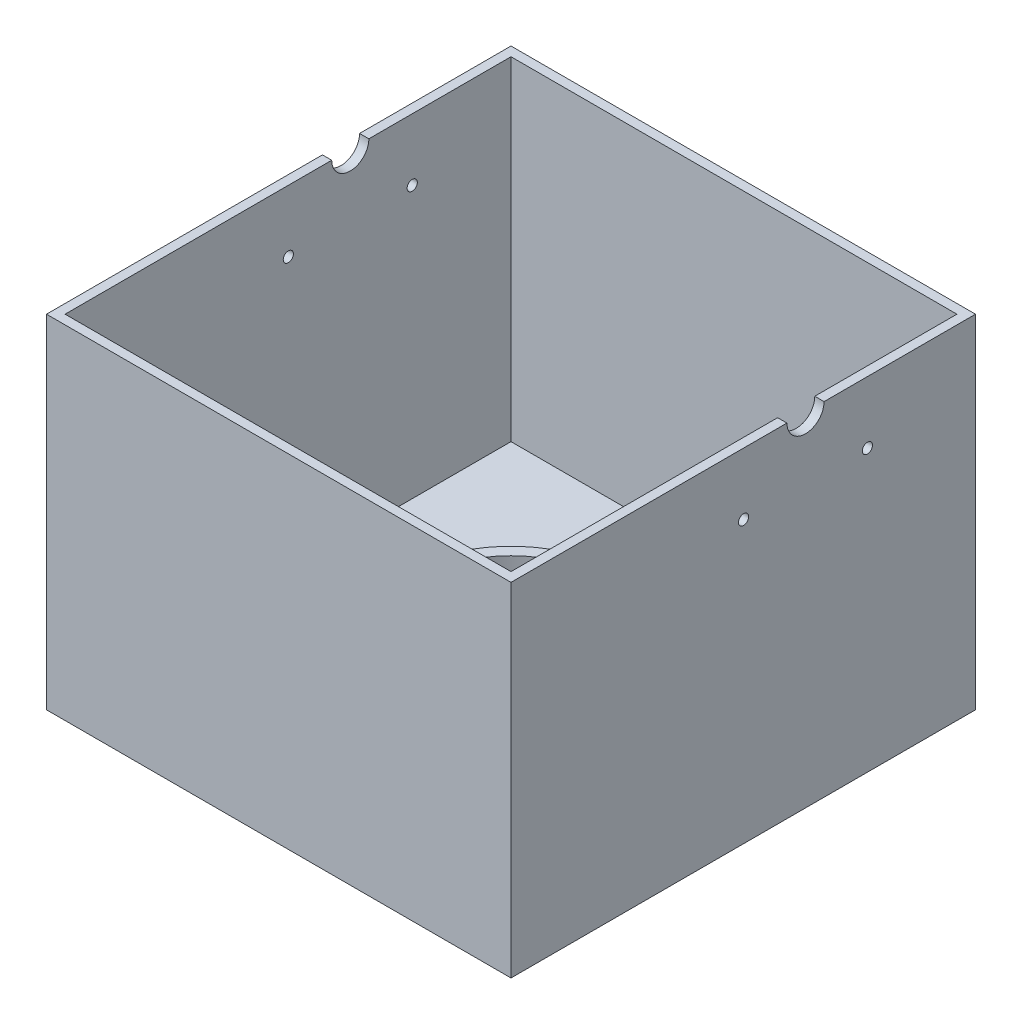
ISO-10303-21;
HEADER;
FILE_DESCRIPTION(('STEP AP214'),'2;1');
FILE_NAME('part.step','',(''),(''),'','','');
FILE_SCHEMA(('AUTOMOTIVE_DESIGN { 1 0 10303 214 1 1 1 1 }'));
ENDSEC;
DATA;
#1=APPLICATION_CONTEXT('core data for automotive mechanical design processes');
#2=APPLICATION_PROTOCOL_DEFINITION('international standard','automotive_design',2000,#1);
#3=PRODUCT_CONTEXT('',#1,'mechanical');
#4=PRODUCT('Part','Part','',(#3));
#5=PRODUCT_RELATED_PRODUCT_CATEGORY('part','',(#4));
#6=PRODUCT_DEFINITION_FORMATION('','',#4);
#7=PRODUCT_DEFINITION_CONTEXT('part definition',#1,'design');
#8=PRODUCT_DEFINITION('design','',#6,#7);
#9=PRODUCT_DEFINITION_SHAPE('','',#8);
#10=(LENGTH_UNIT() NAMED_UNIT(*) SI_UNIT(.MILLI.,.METRE.));
#11=(NAMED_UNIT(*) PLANE_ANGLE_UNIT() SI_UNIT($,.RADIAN.));
#12=(NAMED_UNIT(*) SI_UNIT($,.STERADIAN.) SOLID_ANGLE_UNIT());
#13=UNCERTAINTY_MEASURE_WITH_UNIT(LENGTH_MEASURE(1.E-05),#10,'distance_accuracy_value','');
#14=(GEOMETRIC_REPRESENTATION_CONTEXT(3) GLOBAL_UNCERTAINTY_ASSIGNED_CONTEXT((#13)) GLOBAL_UNIT_ASSIGNED_CONTEXT((#10,
#11,#12)) REPRESENTATION_CONTEXT('',''));
#15=CARTESIAN_POINT('',(0.,0.,0.));
#16=DIRECTION('',(0.,0.,1.));
#17=DIRECTION('',(1.,0.,0.));
#18=AXIS2_PLACEMENT_3D('',#15,#16,#17);
#19=CARTESIAN_POINT('',(0.,91.,0.));
#20=DIRECTION('',(0.,-1.,0.));
#21=DIRECTION('',(0.,0.,-1.));
#22=AXIS2_PLACEMENT_3D('',#19,#20,#21);
#23=CYLINDRICAL_SURFACE('',#22,31.25);
#24=CARTESIAN_POINT('',(0.,21.,0.));
#25=DIRECTION('',(0.,1.,0.));
#26=DIRECTION('',(0.,0.,1.));
#27=AXIS2_PLACEMENT_3D('',#24,#25,#26);
#28=CIRCLE('',#27,31.25);
#29=CARTESIAN_POINT('',(0.,21.,31.25));
#30=VERTEX_POINT('',#29);
#31=EDGE_CURVE('E211',#30,#30,#28,.T.);
#32=ORIENTED_EDGE('',*,*,#31,.T.);
#33=EDGE_LOOP('',(#32));
#34=FACE_BOUND('',#33,.T.);
#35=CARTESIAN_POINT('',(0.,-12.,0.));
#36=DIRECTION('',(0.,-1.,0.));
#37=DIRECTION('',(0.,0.,-1.));
#38=AXIS2_PLACEMENT_3D('',#35,#36,#37);
#39=CIRCLE('',#38,31.25);
#40=CARTESIAN_POINT('',(0.,-12.,-31.25));
#41=VERTEX_POINT('',#40);
#42=EDGE_CURVE('E11',#41,#41,#39,.F.);
#43=ORIENTED_EDGE('',*,*,#42,.F.);
#44=EDGE_LOOP('',(#43));
#45=FACE_BOUND('',#44,.T.);
#46=ADVANCED_FACE('F39',(#34,#45),#23,.F.);
#47=CARTESIAN_POINT('',(0.,0.,0.));
#48=DIRECTION('',(0.,1.,0.));
#49=DIRECTION('',(0.,0.,1.));
#50=AXIS2_PLACEMENT_3D('',#47,#48,#49);
#51=PLANE('',#50);
#52=DIRECTION('',(0.,0.,-1.));
#53=VECTOR('',#52,1.);
#54=CARTESIAN_POINT('',(75.,0.,-75.));
#55=LINE('',#54,#53);
#56=CARTESIAN_POINT('',(75.,0.,75.));
#57=VERTEX_POINT('',#56);
#58=CARTESIAN_POINT('',(75.,0.,-75.));
#59=VERTEX_POINT('',#58);
#60=EDGE_CURVE('E158',#57,#59,#55,.T.);
#61=ORIENTED_EDGE('',*,*,#60,.F.);
#62=DIRECTION('',(1.,0.,0.));
#63=VECTOR('',#62,1.);
#64=CARTESIAN_POINT('',(-75.,0.,75.));
#65=LINE('',#64,#63);
#66=CARTESIAN_POINT('',(-75.,0.,75.));
#67=VERTEX_POINT('',#66);
#68=EDGE_CURVE('E172',#67,#57,#65,.T.);
#69=ORIENTED_EDGE('',*,*,#68,.F.);
#70=DIRECTION('',(0.,0.,1.));
#71=VECTOR('',#70,1.);
#72=CARTESIAN_POINT('',(-75.,0.,-75.));
#73=LINE('',#72,#71);
#74=CARTESIAN_POINT('',(-75.,0.,-75.));
#75=VERTEX_POINT('',#74);
#76=EDGE_CURVE('E169',#75,#67,#73,.T.);
#77=ORIENTED_EDGE('',*,*,#76,.F.);
#78=DIRECTION('',(-1.,0.,0.));
#79=VECTOR('',#78,1.);
#80=CARTESIAN_POINT('',(-75.,0.,-75.));
#81=LINE('',#80,#79);
#82=EDGE_CURVE('E166',#59,#75,#81,.T.);
#83=ORIENTED_EDGE('',*,*,#82,.F.);
#84=EDGE_LOOP('',(#61,#69,#77,#83));
#85=FACE_BOUND('',#84,.T.);
#86=CARTESIAN_POINT('',(0.,0.,0.));
#87=DIRECTION('',(0.,1.,0.));
#88=DIRECTION('',(0.,0.,1.));
#89=AXIS2_PLACEMENT_3D('',#86,#87,#88);
#90=CIRCLE('',#89,35.);
#91=CARTESIAN_POINT('',(0.,0.,35.));
#92=VERTEX_POINT('',#91);
#93=EDGE_CURVE('E48',#92,#92,#90,.F.);
#94=ORIENTED_EDGE('',*,*,#93,.F.);
#95=EDGE_LOOP('',(#94));
#96=FACE_BOUND('',#95,.T.);
#97=ADVANCED_FACE('F305',(#85,#96),#51,.F.);
#98=CARTESIAN_POINT('',(0.,3.,0.));
#99=DIRECTION('',(0.,1.,0.));
#100=DIRECTION('',(0.,0.,1.));
#101=AXIS2_PLACEMENT_3D('',#98,#99,#100);
#102=PLANE('',#101);
#103=DIRECTION('',(0.,0.,1.));
#104=VECTOR('',#103,1.);
#105=CARTESIAN_POINT('',(-72.,3.,72.));
#106=LINE('',#105,#104);
#107=CARTESIAN_POINT('',(-72.,3.,-72.));
#108=VERTEX_POINT('',#107);
#109=CARTESIAN_POINT('',(-72.,3.,72.));
#110=VERTEX_POINT('',#109);
#111=EDGE_CURVE('E258',#108,#110,#106,.T.);
#112=ORIENTED_EDGE('',*,*,#111,.T.);
#113=DIRECTION('',(1.,0.,0.));
#114=VECTOR('',#113,1.);
#115=CARTESIAN_POINT('',(72.,3.,72.));
#116=LINE('',#115,#114);
#117=CARTESIAN_POINT('',(72.,3.,72.));
#118=VERTEX_POINT('',#117);
#119=EDGE_CURVE('E261',#110,#118,#116,.T.);
#120=ORIENTED_EDGE('',*,*,#119,.T.);
#121=DIRECTION('',(0.,0.,-1.));
#122=VECTOR('',#121,1.);
#123=CARTESIAN_POINT('',(72.,3.,72.));
#124=LINE('',#123,#122);
#125=CARTESIAN_POINT('',(72.,3.,-72.));
#126=VERTEX_POINT('',#125);
#127=EDGE_CURVE('E264',#118,#126,#124,.T.);
#128=ORIENTED_EDGE('',*,*,#127,.T.);
#129=DIRECTION('',(-1.,0.,0.));
#130=VECTOR('',#129,1.);
#131=CARTESIAN_POINT('',(72.,3.,-72.));
#132=LINE('',#131,#130);
#133=EDGE_CURVE('E267',#126,#108,#132,.T.);
#134=ORIENTED_EDGE('',*,*,#133,.T.);
#135=EDGE_LOOP('',(#112,#120,#128,#134));
#136=FACE_BOUND('',#135,.T.);
#137=CARTESIAN_POINT('',(0.,3.,0.));
#138=DIRECTION('',(0.,1.,0.));
#139=DIRECTION('',(0.,0.,1.));
#140=AXIS2_PLACEMENT_3D('',#137,#138,#139);
#141=CIRCLE('',#140,35.);
#142=CARTESIAN_POINT('',(0.,3.,35.));
#143=VERTEX_POINT('',#142);
#144=EDGE_CURVE('E192',#143,#143,#141,.F.);
#145=ORIENTED_EDGE('',*,*,#144,.T.);
#146=EDGE_LOOP('',(#145));
#147=FACE_BOUND('',#146,.T.);
#148=ADVANCED_FACE('F333',(#136,#147),#102,.T.);
#149=CARTESIAN_POINT('',(0.,110.65,0.));
#150=DIRECTION('',(0.,1.,0.));
#151=DIRECTION('',(0.,0.,1.));
#152=AXIS2_PLACEMENT_3D('',#149,#150,#151);
#153=PLANE('',#152);
#154=DIRECTION('',(-1.,0.,0.));
#155=VECTOR('',#154,1.);
#156=CARTESIAN_POINT('',(75.,110.65,-26.1));
#157=LINE('',#156,#155);
#158=CARTESIAN_POINT('',(75.,110.65,-26.1));
#159=VERTEX_POINT('',#158);
#160=CARTESIAN_POINT('',(72.,110.65,-26.1));
#161=VERTEX_POINT('',#160);
#162=EDGE_CURVE('E63',#159,#161,#157,.T.);
#163=ORIENTED_EDGE('',*,*,#162,.F.);
#164=DIRECTION('',(0.,0.,-1.));
#165=VECTOR('',#164,1.);
#166=CARTESIAN_POINT('',(75.,110.65,75.));
#167=LINE('',#166,#165);
#168=CARTESIAN_POINT('',(75.,110.65,-75.));
#169=VERTEX_POINT('',#168);
#170=EDGE_CURVE('E144',#159,#169,#167,.T.);
#171=ORIENTED_EDGE('',*,*,#170,.T.);
#172=DIRECTION('',(-1.,0.,0.));
#173=VECTOR('',#172,1.);
#174=CARTESIAN_POINT('',(75.,110.65,-75.));
#175=LINE('',#174,#173);
#176=CARTESIAN_POINT('',(-75.,110.65,-75.));
#177=VERTEX_POINT('',#176);
#178=EDGE_CURVE('E153',#169,#177,#175,.T.);
#179=ORIENTED_EDGE('',*,*,#178,.T.);
#180=DIRECTION('',(0.,0.,1.));
#181=VECTOR('',#180,1.);
#182=CARTESIAN_POINT('',(-75.,110.65,75.));
#183=LINE('',#182,#181);
#184=CARTESIAN_POINT('',(-75.,110.65,-26.1));
#185=VERTEX_POINT('',#184);
#186=EDGE_CURVE('E285',#177,#185,#183,.T.);
#187=ORIENTED_EDGE('',*,*,#186,.T.);
#188=CARTESIAN_POINT('',(-72.,110.65,-26.1));
#189=VERTEX_POINT('',#188);
#190=EDGE_CURVE('E239',#189,#185,#157,.T.);
#191=ORIENTED_EDGE('',*,*,#190,.F.);
#192=DIRECTION('',(0.,0.,1.));
#193=VECTOR('',#192,1.);
#194=CARTESIAN_POINT('',(-72.,110.65,72.));
#195=LINE('',#194,#193);
#196=CARTESIAN_POINT('',(-72.,110.65,-72.));
#197=VERTEX_POINT('',#196);
#198=EDGE_CURVE('E242',#197,#189,#195,.T.);
#199=ORIENTED_EDGE('',*,*,#198,.F.);
#200=DIRECTION('',(-1.,0.,0.));
#201=VECTOR('',#200,1.);
#202=CARTESIAN_POINT('',(72.,110.65,-72.));
#203=LINE('',#202,#201);
#204=CARTESIAN_POINT('',(72.,110.65,-72.));
#205=VERTEX_POINT('',#204);
#206=EDGE_CURVE('E254',#205,#197,#203,.T.);
#207=ORIENTED_EDGE('',*,*,#206,.F.);
#208=DIRECTION('',(0.,0.,-1.));
#209=VECTOR('',#208,1.);
#210=CARTESIAN_POINT('',(72.,110.65,72.));
#211=LINE('',#210,#209);
#212=EDGE_CURVE('E250',#161,#205,#211,.T.);
#213=ORIENTED_EDGE('',*,*,#212,.F.);
#214=EDGE_LOOP('',(#163,#171,#179,#187,#191,#199,#207,#213));
#215=FACE_BOUND('',#214,.T.);
#216=ADVANCED_FACE('F310',(#215),#153,.T.);
#217=CARTESIAN_POINT('',(75.,3.,-75.));
#218=DIRECTION('',(-1.,0.,0.));
#219=DIRECTION('',(0.,0.,1.));
#220=AXIS2_PLACEMENT_3D('',#217,#218,#219);
#221=PLANE('',#220);
#222=CARTESIAN_POINT('',(75.,90.65,-40.1));
#223=DIRECTION('',(-1.,0.,0.));
#224=DIRECTION('',(0.,0.,1.));
#225=AXIS2_PLACEMENT_3D('',#222,#223,#224);
#226=CIRCLE('',#225,1.65);
#227=CARTESIAN_POINT('',(75.,90.65,-38.45));
#228=VERTEX_POINT('',#227);
#229=EDGE_CURVE('E201',#228,#228,#226,.T.);
#230=ORIENTED_EDGE('',*,*,#229,.T.);
#231=EDGE_LOOP('',(#230));
#232=FACE_BOUND('',#231,.T.);
#233=CARTESIAN_POINT('',(75.,90.65,-0.10000000000001));
#234=DIRECTION('',(-1.,0.,0.));
#235=DIRECTION('',(0.,0.,1.));
#236=AXIS2_PLACEMENT_3D('',#233,#234,#235);
#237=CIRCLE('',#236,1.65);
#238=CARTESIAN_POINT('',(75.,90.65,1.54999999999999));
#239=VERTEX_POINT('',#238);
#240=EDGE_CURVE('E411',#239,#239,#237,.T.);
#241=ORIENTED_EDGE('',*,*,#240,.T.);
#242=EDGE_LOOP('',(#241));
#243=FACE_BOUND('',#242,.T.);
#244=ORIENTED_EDGE('',*,*,#170,.F.);
#245=CARTESIAN_POINT('',(75.,110.65,-20.1));
#246=DIRECTION('',(-1.,0.,0.));
#247=DIRECTION('',(0.,0.,1.));
#248=AXIS2_PLACEMENT_3D('',#245,#246,#247);
#249=CIRCLE('',#248,6.);
#250=CARTESIAN_POINT('',(75.,110.65,-14.1));
#251=VERTEX_POINT('',#250);
#252=EDGE_CURVE('E130',#159,#251,#249,.T.);
#253=ORIENTED_EDGE('',*,*,#252,.T.);
#254=CARTESIAN_POINT('',(75.,110.65,75.));
#255=VERTEX_POINT('',#254);
#256=EDGE_CURVE('E142',#255,#251,#167,.T.);
#257=ORIENTED_EDGE('',*,*,#256,.F.);
#258=DIRECTION('',(0.,-1.,0.));
#259=VECTOR('',#258,1.);
#260=CARTESIAN_POINT('',(75.,3.,75.));
#261=LINE('',#260,#259);
#262=EDGE_CURVE('E175',#255,#57,#261,.T.);
#263=ORIENTED_EDGE('',*,*,#262,.T.);
#264=ORIENTED_EDGE('',*,*,#60,.T.);
#265=DIRECTION('',(0.,-1.,0.));
#266=VECTOR('',#265,1.);
#267=CARTESIAN_POINT('',(75.,3.,-75.));
#268=LINE('',#267,#266);
#269=EDGE_CURVE('E186',#169,#59,#268,.T.);
#270=ORIENTED_EDGE('',*,*,#269,.F.);
#271=EDGE_LOOP('',(#244,#253,#257,#263,#264,#270));
#272=FACE_BOUND('',#271,.T.);
#273=ADVANCED_FACE('F41',(#232,#243,#272),#221,.F.);
#274=CARTESIAN_POINT('',(-75.,3.,-75.));
#275=DIRECTION('',(0.,0.,1.));
#276=DIRECTION('',(1.,0.,0.));
#277=AXIS2_PLACEMENT_3D('',#274,#275,#276);
#278=PLANE('',#277);
#279=ORIENTED_EDGE('',*,*,#82,.T.);
#280=DIRECTION('',(0.,-1.,0.));
#281=VECTOR('',#280,1.);
#282=CARTESIAN_POINT('',(-75.,3.,-75.));
#283=LINE('',#282,#281);
#284=EDGE_CURVE('E182',#177,#75,#283,.T.);
#285=ORIENTED_EDGE('',*,*,#284,.F.);
#286=ORIENTED_EDGE('',*,*,#178,.F.);
#287=ORIENTED_EDGE('',*,*,#269,.T.);
#288=EDGE_LOOP('',(#279,#285,#286,#287));
#289=FACE_BOUND('',#288,.T.);
#290=ADVANCED_FACE('F309',(#289),#278,.F.);
#291=CARTESIAN_POINT('',(-75.,3.,-75.));
#292=DIRECTION('',(1.,0.,0.));
#293=DIRECTION('',(0.,0.,-1.));
#294=AXIS2_PLACEMENT_3D('',#291,#292,#293);
#295=PLANE('',#294);
#296=CARTESIAN_POINT('',(-75.,90.65,-40.1));
#297=DIRECTION('',(-1.,0.,0.));
#298=DIRECTION('',(0.,0.,1.));
#299=AXIS2_PLACEMENT_3D('',#296,#297,#298);
#300=CIRCLE('',#299,1.65);
#301=CARTESIAN_POINT('',(-75.,90.65,-38.45));
#302=VERTEX_POINT('',#301);
#303=EDGE_CURVE('E408',#302,#302,#300,.T.);
#304=ORIENTED_EDGE('',*,*,#303,.F.);
#305=EDGE_LOOP('',(#304));
#306=FACE_BOUND('',#305,.T.);
#307=CARTESIAN_POINT('',(-75.,90.65,-0.099999999999982));
#308=DIRECTION('',(-1.,0.,0.));
#309=DIRECTION('',(0.,0.,1.));
#310=AXIS2_PLACEMENT_3D('',#307,#308,#309);
#311=CIRCLE('',#310,1.65);
#312=CARTESIAN_POINT('',(-75.,90.65,1.55000000000002));
#313=VERTEX_POINT('',#312);
#314=EDGE_CURVE('E218',#313,#313,#311,.T.);
#315=ORIENTED_EDGE('',*,*,#314,.F.);
#316=EDGE_LOOP('',(#315));
#317=FACE_BOUND('',#316,.T.);
#318=CARTESIAN_POINT('',(-75.,110.65,-14.1));
#319=VERTEX_POINT('',#318);
#320=CARTESIAN_POINT('',(-75.,110.65,75.));
#321=VERTEX_POINT('',#320);
#322=EDGE_CURVE('E284',#319,#321,#183,.T.);
#323=ORIENTED_EDGE('',*,*,#322,.F.);
#324=CARTESIAN_POINT('',(-75.,110.65,-20.1));
#325=DIRECTION('',(-1.,0.,0.));
#326=DIRECTION('',(0.,0.,1.));
#327=AXIS2_PLACEMENT_3D('',#324,#325,#326);
#328=CIRCLE('',#327,6.);
#329=EDGE_CURVE('E146',#185,#319,#328,.T.);
#330=ORIENTED_EDGE('',*,*,#329,.F.);
#331=ORIENTED_EDGE('',*,*,#186,.F.);
#332=ORIENTED_EDGE('',*,*,#284,.T.);
#333=ORIENTED_EDGE('',*,*,#76,.T.);
#334=DIRECTION('',(0.,-1.,0.));
#335=VECTOR('',#334,1.);
#336=CARTESIAN_POINT('',(-75.,3.,75.));
#337=LINE('',#336,#335);
#338=EDGE_CURVE('E178',#321,#67,#337,.T.);
#339=ORIENTED_EDGE('',*,*,#338,.F.);
#340=EDGE_LOOP('',(#323,#330,#331,#332,#333,#339));
#341=FACE_BOUND('',#340,.T.);
#342=ADVANCED_FACE('F298',(#306,#317,#341),#295,.F.);
#343=CARTESIAN_POINT('',(-75.,3.,75.));
#344=DIRECTION('',(0.,0.,-1.));
#345=DIRECTION('',(-1.,0.,0.));
#346=AXIS2_PLACEMENT_3D('',#343,#344,#345);
#347=PLANE('',#346);
#348=ORIENTED_EDGE('',*,*,#68,.T.);
#349=ORIENTED_EDGE('',*,*,#262,.F.);
#350=DIRECTION('',(1.,0.,0.));
#351=VECTOR('',#350,1.);
#352=CARTESIAN_POINT('',(75.,110.65,75.));
#353=LINE('',#352,#351);
#354=EDGE_CURVE('E151',#321,#255,#353,.T.);
#355=ORIENTED_EDGE('',*,*,#354,.F.);
#356=ORIENTED_EDGE('',*,*,#338,.T.);
#357=EDGE_LOOP('',(#348,#349,#355,#356));
#358=FACE_BOUND('',#357,.T.);
#359=ADVANCED_FACE('F302',(#358),#347,.F.);
#360=DIRECTION('',(-1.,0.,0.));
#361=VECTOR('',#360,1.);
#362=CARTESIAN_POINT('',(75.,110.65,-14.1));
#363=LINE('',#362,#361);
#364=CARTESIAN_POINT('',(-72.,110.65,-14.1));
#365=VERTEX_POINT('',#364);
#366=EDGE_CURVE('E55',#319,#365,#363,.F.);
#367=ORIENTED_EDGE('',*,*,#366,.F.);
#368=ORIENTED_EDGE('',*,*,#322,.T.);
#369=ORIENTED_EDGE('',*,*,#354,.T.);
#370=ORIENTED_EDGE('',*,*,#256,.T.);
#371=CARTESIAN_POINT('',(72.,110.65,-14.1));
#372=VERTEX_POINT('',#371);
#373=EDGE_CURVE('E127',#372,#251,#363,.F.);
#374=ORIENTED_EDGE('',*,*,#373,.F.);
#375=CARTESIAN_POINT('',(72.,110.65,72.));
#376=VERTEX_POINT('',#375);
#377=EDGE_CURVE('E251',#376,#372,#211,.T.);
#378=ORIENTED_EDGE('',*,*,#377,.F.);
#379=DIRECTION('',(1.,0.,0.));
#380=VECTOR('',#379,1.);
#381=CARTESIAN_POINT('',(72.,110.65,72.));
#382=LINE('',#381,#380);
#383=CARTESIAN_POINT('',(-72.,110.65,72.));
#384=VERTEX_POINT('',#383);
#385=EDGE_CURVE('E246',#384,#376,#382,.T.);
#386=ORIENTED_EDGE('',*,*,#385,.F.);
#387=EDGE_CURVE('E247',#365,#384,#195,.T.);
#388=ORIENTED_EDGE('',*,*,#387,.F.);
#389=EDGE_LOOP('',(#367,#368,#369,#370,#374,#378,#386,#388));
#390=FACE_BOUND('',#389,.T.);
#391=ADVANCED_FACE('F149',(#390),#153,.T.);
#392=CARTESIAN_POINT('',(-72.,110.65,72.));
#393=DIRECTION('',(1.,0.,0.));
#394=DIRECTION('',(0.,0.,-1.));
#395=AXIS2_PLACEMENT_3D('',#392,#393,#394);
#396=PLANE('',#395);
#397=CARTESIAN_POINT('',(-72.,90.65,-40.1));
#398=DIRECTION('',(1.,0.,0.));
#399=DIRECTION('',(0.,0.,-1.));
#400=AXIS2_PLACEMENT_3D('',#397,#398,#399);
#401=CIRCLE('',#400,1.65);
#402=CARTESIAN_POINT('',(-72.,90.65,-41.75));
#403=VERTEX_POINT('',#402);
#404=EDGE_CURVE('E205',#403,#403,#401,.T.);
#405=ORIENTED_EDGE('',*,*,#404,.F.);
#406=EDGE_LOOP('',(#405));
#407=FACE_BOUND('',#406,.T.);
#408=CARTESIAN_POINT('',(-72.,90.65,-0.0999999999999826));
#409=DIRECTION('',(1.,0.,0.));
#410=DIRECTION('',(0.,0.,-1.));
#411=AXIS2_PLACEMENT_3D('',#408,#409,#410);
#412=CIRCLE('',#411,1.65);
#413=CARTESIAN_POINT('',(-72.,90.65,-1.74999999999998));
#414=VERTEX_POINT('',#413);
#415=EDGE_CURVE('E200',#414,#414,#412,.T.);
#416=ORIENTED_EDGE('',*,*,#415,.F.);
#417=EDGE_LOOP('',(#416));
#418=FACE_BOUND('',#417,.T.);
#419=CARTESIAN_POINT('',(-72.,110.65,-20.1));
#420=DIRECTION('',(1.,0.,0.));
#421=DIRECTION('',(0.,0.,-1.));
#422=AXIS2_PLACEMENT_3D('',#419,#420,#421);
#423=CIRCLE('',#422,6.);
#424=EDGE_CURVE('E238',#365,#189,#423,.T.);
#425=ORIENTED_EDGE('',*,*,#424,.F.);
#426=ORIENTED_EDGE('',*,*,#387,.T.);
#427=DIRECTION('',(0.,-1.,0.));
#428=VECTOR('',#427,1.);
#429=CARTESIAN_POINT('',(-72.,110.65,72.));
#430=LINE('',#429,#428);
#431=EDGE_CURVE('E281',#384,#110,#430,.T.);
#432=ORIENTED_EDGE('',*,*,#431,.T.);
#433=ORIENTED_EDGE('',*,*,#111,.F.);
#434=DIRECTION('',(0.,-1.,0.));
#435=VECTOR('',#434,1.);
#436=CARTESIAN_POINT('',(-72.,110.65,-72.));
#437=LINE('',#436,#435);
#438=EDGE_CURVE('E257',#197,#108,#437,.T.);
#439=ORIENTED_EDGE('',*,*,#438,.F.);
#440=ORIENTED_EDGE('',*,*,#198,.T.);
#441=EDGE_LOOP('',(#425,#426,#432,#433,#439,#440));
#442=FACE_BOUND('',#441,.T.);
#443=ADVANCED_FACE('F328',(#407,#418,#442),#396,.T.);
#444=CARTESIAN_POINT('',(72.,110.65,72.));
#445=DIRECTION('',(0.,0.,-1.));
#446=DIRECTION('',(-1.,0.,0.));
#447=AXIS2_PLACEMENT_3D('',#444,#445,#446);
#448=PLANE('',#447);
#449=ORIENTED_EDGE('',*,*,#119,.F.);
#450=ORIENTED_EDGE('',*,*,#431,.F.);
#451=ORIENTED_EDGE('',*,*,#385,.T.);
#452=DIRECTION('',(0.,-1.,0.));
#453=VECTOR('',#452,1.);
#454=CARTESIAN_POINT('',(72.,110.65,72.));
#455=LINE('',#454,#453);
#456=EDGE_CURVE('E277',#376,#118,#455,.T.);
#457=ORIENTED_EDGE('',*,*,#456,.T.);
#458=EDGE_LOOP('',(#449,#450,#451,#457));
#459=FACE_BOUND('',#458,.T.);
#460=ADVANCED_FACE('F336',(#459),#448,.T.);
#461=CARTESIAN_POINT('',(72.,110.65,72.));
#462=DIRECTION('',(-1.,0.,0.));
#463=DIRECTION('',(0.,0.,1.));
#464=AXIS2_PLACEMENT_3D('',#461,#462,#463);
#465=PLANE('',#464);
#466=CARTESIAN_POINT('',(72.,90.65,-40.1));
#467=DIRECTION('',(-1.,0.,0.));
#468=DIRECTION('',(0.,0.,1.));
#469=AXIS2_PLACEMENT_3D('',#466,#467,#468);
#470=CIRCLE('',#469,1.65);
#471=CARTESIAN_POINT('',(72.,90.65,-38.45));
#472=VERTEX_POINT('',#471);
#473=EDGE_CURVE('E202',#472,#472,#470,.T.);
#474=ORIENTED_EDGE('',*,*,#473,.F.);
#475=EDGE_LOOP('',(#474));
#476=FACE_BOUND('',#475,.T.);
#477=CARTESIAN_POINT('',(72.,90.65,-0.100000000000009));
#478=DIRECTION('',(-1.,0.,0.));
#479=DIRECTION('',(0.,0.,1.));
#480=AXIS2_PLACEMENT_3D('',#477,#478,#479);
#481=CIRCLE('',#480,1.65);
#482=CARTESIAN_POINT('',(72.,90.65,1.54999999999999));
#483=VERTEX_POINT('',#482);
#484=EDGE_CURVE('E197',#483,#483,#481,.T.);
#485=ORIENTED_EDGE('',*,*,#484,.F.);
#486=EDGE_LOOP('',(#485));
#487=FACE_BOUND('',#486,.T.);
#488=CARTESIAN_POINT('',(72.,110.65,-20.1));
#489=DIRECTION('',(-1.,0.,0.));
#490=DIRECTION('',(0.,0.,1.));
#491=AXIS2_PLACEMENT_3D('',#488,#489,#490);
#492=CIRCLE('',#491,6.);
#493=EDGE_CURVE('E131',#161,#372,#492,.T.);
#494=ORIENTED_EDGE('',*,*,#493,.F.);
#495=ORIENTED_EDGE('',*,*,#212,.T.);
#496=DIRECTION('',(0.,-1.,0.));
#497=VECTOR('',#496,1.);
#498=CARTESIAN_POINT('',(72.,110.65,-72.));
#499=LINE('',#498,#497);
#500=EDGE_CURVE('E273',#205,#126,#499,.T.);
#501=ORIENTED_EDGE('',*,*,#500,.T.);
#502=ORIENTED_EDGE('',*,*,#127,.F.);
#503=ORIENTED_EDGE('',*,*,#456,.F.);
#504=ORIENTED_EDGE('',*,*,#377,.T.);
#505=EDGE_LOOP('',(#494,#495,#501,#502,#503,#504));
#506=FACE_BOUND('',#505,.T.);
#507=ADVANCED_FACE('F320',(#476,#487,#506),#465,.T.);
#508=CARTESIAN_POINT('',(72.,110.65,-72.));
#509=DIRECTION('',(0.,0.,1.));
#510=DIRECTION('',(1.,0.,0.));
#511=AXIS2_PLACEMENT_3D('',#508,#509,#510);
#512=PLANE('',#511);
#513=ORIENTED_EDGE('',*,*,#133,.F.);
#514=ORIENTED_EDGE('',*,*,#500,.F.);
#515=ORIENTED_EDGE('',*,*,#206,.T.);
#516=ORIENTED_EDGE('',*,*,#438,.T.);
#517=EDGE_LOOP('',(#513,#514,#515,#516));
#518=FACE_BOUND('',#517,.T.);
#519=ADVANCED_FACE('F325',(#518),#512,.T.);
#520=CARTESIAN_POINT('',(75.,110.65,-20.1));
#521=DIRECTION('',(-1.,0.,0.));
#522=DIRECTION('',(0.,0.,1.));
#523=AXIS2_PLACEMENT_3D('',#520,#521,#522);
#524=CYLINDRICAL_SURFACE('',#523,6.);
#525=ORIENTED_EDGE('',*,*,#162,.T.);
#526=ORIENTED_EDGE('',*,*,#493,.T.);
#527=ORIENTED_EDGE('',*,*,#373,.T.);
#528=ORIENTED_EDGE('',*,*,#252,.F.);
#529=EDGE_LOOP('',(#525,#526,#527,#528));
#530=FACE_BOUND('',#529,.T.);
#531=ADVANCED_FACE('F129',(#530),#524,.F.);
#532=ORIENTED_EDGE('',*,*,#190,.T.);
#533=ORIENTED_EDGE('',*,*,#329,.T.);
#534=ORIENTED_EDGE('',*,*,#366,.T.);
#535=ORIENTED_EDGE('',*,*,#424,.T.);
#536=EDGE_LOOP('',(#532,#533,#534,#535));
#537=FACE_BOUND('',#536,.T.);
#538=ADVANCED_FACE('F311',(#537),#524,.F.);
#539=CARTESIAN_POINT('',(0.,21.,0.));
#540=DIRECTION('',(0.,-1.,0.));
#541=DIRECTION('',(0.,0.,-1.));
#542=AXIS2_PLACEMENT_3D('',#539,#540,#541);
#543=CYLINDRICAL_SURFACE('',#542,35.);
#544=ORIENTED_EDGE('',*,*,#144,.F.);
#545=EDGE_LOOP('',(#544));
#546=FACE_BOUND('',#545,.T.);
#547=CARTESIAN_POINT('',(0.,21.,0.));
#548=DIRECTION('',(0.,1.,0.));
#549=DIRECTION('',(0.,0.,1.));
#550=AXIS2_PLACEMENT_3D('',#547,#548,#549);
#551=CIRCLE('',#550,35.);
#552=CARTESIAN_POINT('',(0.,21.,35.));
#553=VERTEX_POINT('',#552);
#554=EDGE_CURVE('E196',#553,#553,#551,.T.);
#555=ORIENTED_EDGE('',*,*,#554,.F.);
#556=EDGE_LOOP('',(#555));
#557=FACE_BOUND('',#556,.T.);
#558=ADVANCED_FACE('F367',(#546,#557),#543,.T.);
#559=CARTESIAN_POINT('',(0.,21.,0.));
#560=DIRECTION('',(0.,1.,0.));
#561=DIRECTION('',(0.,0.,1.));
#562=AXIS2_PLACEMENT_3D('',#559,#560,#561);
#563=PLANE('',#562);
#564=ORIENTED_EDGE('',*,*,#554,.T.);
#565=EDGE_LOOP('',(#564));
#566=FACE_BOUND('',#565,.T.);
#567=ORIENTED_EDGE('',*,*,#31,.F.);
#568=EDGE_LOOP('',(#567));
#569=FACE_BOUND('',#568,.T.);
#570=ADVANCED_FACE('F371',(#566,#569),#563,.T.);
#571=CARTESIAN_POINT('',(0.,-15.,0.));
#572=DIRECTION('',(0.,1.,0.));
#573=DIRECTION('',(0.,0.,1.));
#574=AXIS2_PLACEMENT_3D('',#571,#572,#573);
#575=CIRCLE('',#574,35.);
#576=CARTESIAN_POINT('',(0.,-15.,35.));
#577=VERTEX_POINT('',#576);
#578=EDGE_CURVE('E224',#577,#577,#575,.T.);
#579=ORIENTED_EDGE('',*,*,#578,.T.);
#580=EDGE_LOOP('',(#579));
#581=FACE_BOUND('',#580,.T.);
#582=ORIENTED_EDGE('',*,*,#93,.T.);
#583=EDGE_LOOP('',(#582));
#584=FACE_BOUND('',#583,.T.);
#585=ADVANCED_FACE('F373',(#581,#584),#543,.T.);
#586=CARTESIAN_POINT('',(0.,-15.,0.));
#587=DIRECTION('',(0.,1.,0.));
#588=DIRECTION('',(0.,0.,1.));
#589=AXIS2_PLACEMENT_3D('',#586,#587,#588);
#590=PLANE('',#589);
#591=ORIENTED_EDGE('',*,*,#578,.F.);
#592=EDGE_LOOP('',(#591));
#593=FACE_BOUND('',#592,.T.);
#594=CARTESIAN_POINT('',(0.,-15.,0.));
#595=DIRECTION('',(0.,-1.,0.));
#596=DIRECTION('',(0.,0.,-1.));
#597=AXIS2_PLACEMENT_3D('',#594,#595,#596);
#598=CIRCLE('',#597,27.5);
#599=CARTESIAN_POINT('',(0.,-15.,-27.5));
#600=VERTEX_POINT('',#599);
#601=EDGE_CURVE('E396',#600,#600,#598,.T.);
#602=ORIENTED_EDGE('',*,*,#601,.F.);
#603=EDGE_LOOP('',(#602));
#604=FACE_BOUND('',#603,.T.);
#605=ADVANCED_FACE('F383',(#593,#604),#590,.F.);
#606=CARTESIAN_POINT('',(75.,90.65,-0.10000000000001));
#607=DIRECTION('',(-1.,0.,0.));
#608=DIRECTION('',(0.,0.,1.));
#609=AXIS2_PLACEMENT_3D('',#606,#607,#608);
#610=CYLINDRICAL_SURFACE('',#609,1.65);
#611=ORIENTED_EDGE('',*,*,#484,.T.);
#612=EDGE_LOOP('',(#611));
#613=FACE_BOUND('',#612,.T.);
#614=ORIENTED_EDGE('',*,*,#240,.F.);
#615=EDGE_LOOP('',(#614));
#616=FACE_BOUND('',#615,.T.);
#617=ADVANCED_FACE('F388',(#613,#616),#610,.F.);
#618=CARTESIAN_POINT('',(75.,90.65,-40.1));
#619=DIRECTION('',(-1.,0.,0.));
#620=DIRECTION('',(0.,0.,1.));
#621=AXIS2_PLACEMENT_3D('',#618,#619,#620);
#622=CYLINDRICAL_SURFACE('',#621,1.65);
#623=ORIENTED_EDGE('',*,*,#473,.T.);
#624=EDGE_LOOP('',(#623));
#625=FACE_BOUND('',#624,.T.);
#626=ORIENTED_EDGE('',*,*,#229,.F.);
#627=EDGE_LOOP('',(#626));
#628=FACE_BOUND('',#627,.T.);
#629=ADVANCED_FACE('F446',(#625,#628),#622,.F.);
#630=ORIENTED_EDGE('',*,*,#415,.T.);
#631=EDGE_LOOP('',(#630));
#632=FACE_BOUND('',#631,.T.);
#633=ORIENTED_EDGE('',*,*,#314,.T.);
#634=EDGE_LOOP('',(#633));
#635=FACE_BOUND('',#634,.T.);
#636=ADVANCED_FACE('F420',(#632,#635),#610,.F.);
#637=ORIENTED_EDGE('',*,*,#404,.T.);
#638=EDGE_LOOP('',(#637));
#639=FACE_BOUND('',#638,.T.);
#640=ORIENTED_EDGE('',*,*,#303,.T.);
#641=EDGE_LOOP('',(#640));
#642=FACE_BOUND('',#641,.T.);
#643=ADVANCED_FACE('F449',(#639,#642),#622,.F.);
#644=CARTESIAN_POINT('',(0.,-12.,0.));
#645=DIRECTION('',(0.,-1.,0.));
#646=DIRECTION('',(0.,0.,-1.));
#647=AXIS2_PLACEMENT_3D('',#644,#645,#646);
#648=PLANE('',#647);
#649=CARTESIAN_POINT('',(0.,-12.,0.));
#650=DIRECTION('',(0.,-1.,0.));
#651=DIRECTION('',(0.,0.,-1.));
#652=AXIS2_PLACEMENT_3D('',#649,#650,#651);
#653=CIRCLE('',#652,27.5);
#654=CARTESIAN_POINT('',(0.,-12.,-27.5));
#655=VERTEX_POINT('',#654);
#656=EDGE_CURVE('E399',#655,#655,#653,.T.);
#657=ORIENTED_EDGE('',*,*,#656,.T.);
#658=EDGE_LOOP('',(#657));
#659=FACE_BOUND('',#658,.T.);
#660=ORIENTED_EDGE('',*,*,#42,.T.);
#661=EDGE_LOOP('',(#660));
#662=FACE_BOUND('',#661,.T.);
#663=ADVANCED_FACE('F458',(#659,#662),#648,.F.);
#664=CARTESIAN_POINT('',(0.,-12.,0.));
#665=DIRECTION('',(0.,-1.,0.));
#666=DIRECTION('',(0.,0.,-1.));
#667=AXIS2_PLACEMENT_3D('',#664,#665,#666);
#668=CYLINDRICAL_SURFACE('',#667,27.5);
#669=ORIENTED_EDGE('',*,*,#656,.F.);
#670=EDGE_LOOP('',(#669));
#671=FACE_BOUND('',#670,.T.);
#672=ORIENTED_EDGE('',*,*,#601,.T.);
#673=EDGE_LOOP('',(#672));
#674=FACE_BOUND('',#673,.T.);
#675=ADVANCED_FACE('F463',(#671,#674),#668,.F.);
#676=CLOSED_SHELL('',(#46,#97,#148,#216,#273,#290,#342,#359,#391,#443,#460,#507,#519,#531,#538,
#558,#570,#585,#605,#617,#629,#636,#643,#663,#675));
#677=MANIFOLD_SOLID_BREP('B2',#676);
#678=ADVANCED_BREP_SHAPE_REPRESENTATION('',(#18,#677),#14);
#679=SHAPE_DEFINITION_REPRESENTATION(#9,#678);
ENDSEC;
END-ISO-10303-21;
